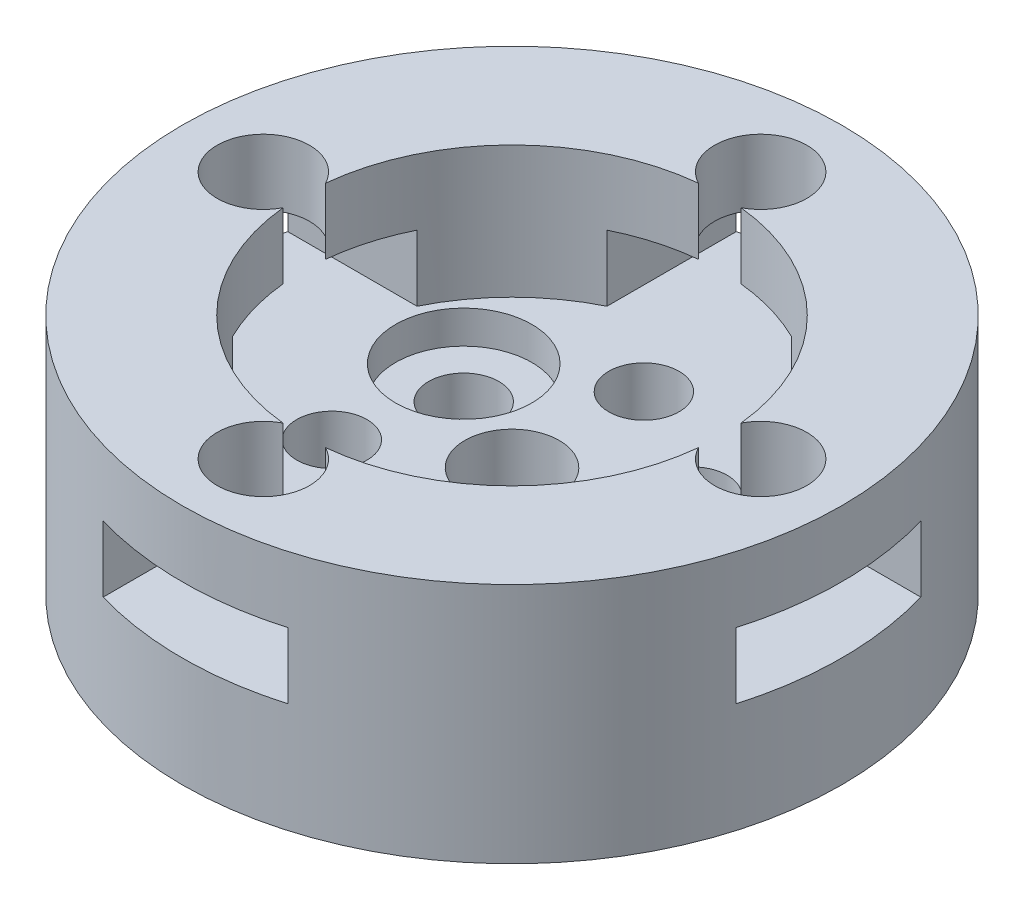
ISO-10303-21;
HEADER;
FILE_DESCRIPTION(('STEP AP214'),'2;1');
FILE_NAME('part.step','',(''),(''),'','','');
FILE_SCHEMA(('AUTOMOTIVE_DESIGN { 1 0 10303 214 1 1 1 1 }'));
ENDSEC;
DATA;
#1=APPLICATION_CONTEXT('core data for automotive mechanical design processes');
#2=APPLICATION_PROTOCOL_DEFINITION('international standard','automotive_design',2000,#1);
#3=PRODUCT_CONTEXT('',#1,'mechanical');
#4=PRODUCT('Part','Part','',(#3));
#5=PRODUCT_RELATED_PRODUCT_CATEGORY('part','',(#4));
#6=PRODUCT_DEFINITION_FORMATION('','',#4);
#7=PRODUCT_DEFINITION_CONTEXT('part definition',#1,'design');
#8=PRODUCT_DEFINITION('design','',#6,#7);
#9=PRODUCT_DEFINITION_SHAPE('','',#8);
#10=(LENGTH_UNIT() NAMED_UNIT(*) SI_UNIT(.MILLI.,.METRE.));
#11=(NAMED_UNIT(*) PLANE_ANGLE_UNIT() SI_UNIT($,.RADIAN.));
#12=(NAMED_UNIT(*) SI_UNIT($,.STERADIAN.) SOLID_ANGLE_UNIT());
#13=UNCERTAINTY_MEASURE_WITH_UNIT(LENGTH_MEASURE(1.E-05),#10,'distance_accuracy_value','');
#14=(GEOMETRIC_REPRESENTATION_CONTEXT(3) GLOBAL_UNCERTAINTY_ASSIGNED_CONTEXT((#13)) GLOBAL_UNIT_ASSIGNED_CONTEXT((#10,
#11,#12)) REPRESENTATION_CONTEXT('',''));
#15=CARTESIAN_POINT('',(0.,0.,0.));
#16=DIRECTION('',(0.,0.,1.));
#17=DIRECTION('',(1.,0.,0.));
#18=AXIS2_PLACEMENT_3D('',#15,#16,#17);
#19=CARTESIAN_POINT('',(0.,11.,0.));
#20=DIRECTION('',(0.,-1.,0.));
#21=DIRECTION('',(0.,0.,-1.));
#22=AXIS2_PLACEMENT_3D('',#19,#20,#21);
#23=CYLINDRICAL_SURFACE('',#22,15.);
#24=CARTESIAN_POINT('',(0.,5.,0.));
#25=DIRECTION('',(0.,-1.,0.));
#26=DIRECTION('',(0.,0.,-1.));
#27=AXIS2_PLACEMENT_3D('',#24,#25,#26);
#28=CIRCLE('',#27,15.);
#29=CARTESIAN_POINT('',(4.19999999999991,5.,-14.4));
#30=VERTEX_POINT('',#29);
#31=CARTESIAN_POINT('',(-4.20000000000009,5.,-14.4));
#32=VERTEX_POINT('',#31);
#33=EDGE_CURVE('E287',#30,#32,#28,.F.);
#34=ORIENTED_EDGE('',*,*,#33,.F.);
#35=DIRECTION('',(0.,-1.,0.));
#36=VECTOR('',#35,1.);
#37=CARTESIAN_POINT('',(4.19999999999991,11.,-14.4));
#38=LINE('',#37,#36);
#39=CARTESIAN_POINT('',(4.19999999999991,8.,-14.4));
#40=VERTEX_POINT('',#39);
#41=EDGE_CURVE('E293',#40,#30,#38,.T.);
#42=ORIENTED_EDGE('',*,*,#41,.F.);
#43=CARTESIAN_POINT('',(0.,8.,0.));
#44=DIRECTION('',(0.,-1.,0.));
#45=DIRECTION('',(0.,0.,-1.));
#46=AXIS2_PLACEMENT_3D('',#43,#44,#45);
#47=CIRCLE('',#46,15.);
#48=CARTESIAN_POINT('',(-4.20000000000009,8.,-14.4));
#49=VERTEX_POINT('',#48);
#50=EDGE_CURVE('E220',#40,#49,#47,.F.);
#51=ORIENTED_EDGE('',*,*,#50,.T.);
#52=DIRECTION('',(0.,-1.,0.));
#53=VECTOR('',#52,1.);
#54=CARTESIAN_POINT('',(-4.20000000000009,11.,-14.4));
#55=LINE('',#54,#53);
#56=EDGE_CURVE('E290',#32,#49,#55,.F.);
#57=ORIENTED_EDGE('',*,*,#56,.F.);
#58=EDGE_LOOP('',(#34,#42,#51,#57));
#59=FACE_BOUND('',#58,.T.);
#60=CARTESIAN_POINT('',(0.,5.,0.));
#61=DIRECTION('',(0.,-1.,0.));
#62=DIRECTION('',(0.,0.,-1.));
#63=AXIS2_PLACEMENT_3D('',#60,#61,#62);
#64=CIRCLE('',#63,15.);
#65=CARTESIAN_POINT('',(14.4000000000001,5.,4.19999999999958));
#66=VERTEX_POINT('',#65);
#67=CARTESIAN_POINT('',(14.3999999999999,5.,-4.20000000000042));
#68=VERTEX_POINT('',#67);
#69=EDGE_CURVE('E277',#66,#68,#64,.F.);
#70=ORIENTED_EDGE('',*,*,#69,.F.);
#71=DIRECTION('',(0.,-1.,0.));
#72=VECTOR('',#71,1.);
#73=CARTESIAN_POINT('',(14.4000000000001,11.,4.19999999999958));
#74=LINE('',#73,#72);
#75=CARTESIAN_POINT('',(14.4000000000001,8.,4.19999999999958));
#76=VERTEX_POINT('',#75);
#77=EDGE_CURVE('E284',#76,#66,#74,.T.);
#78=ORIENTED_EDGE('',*,*,#77,.F.);
#79=CARTESIAN_POINT('',(0.,8.,0.));
#80=DIRECTION('',(0.,-1.,0.));
#81=DIRECTION('',(0.,0.,-1.));
#82=AXIS2_PLACEMENT_3D('',#79,#80,#81);
#83=CIRCLE('',#82,15.);
#84=CARTESIAN_POINT('',(14.3999999999999,8.,-4.20000000000042));
#85=VERTEX_POINT('',#84);
#86=EDGE_CURVE('E247',#76,#85,#83,.F.);
#87=ORIENTED_EDGE('',*,*,#86,.T.);
#88=DIRECTION('',(0.,-1.,0.));
#89=VECTOR('',#88,1.);
#90=CARTESIAN_POINT('',(14.3999999999999,11.,-4.20000000000042));
#91=LINE('',#90,#89);
#92=EDGE_CURVE('E280',#68,#85,#91,.F.);
#93=ORIENTED_EDGE('',*,*,#92,.F.);
#94=EDGE_LOOP('',(#70,#78,#87,#93));
#95=FACE_BOUND('',#94,.T.);
#96=CARTESIAN_POINT('',(0.,5.,0.));
#97=DIRECTION('',(0.,-1.,0.));
#98=DIRECTION('',(0.,0.,-1.));
#99=AXIS2_PLACEMENT_3D('',#96,#97,#98);
#100=CIRCLE('',#99,15.);
#101=CARTESIAN_POINT('',(-4.19999999999967,5.,14.4000000000001));
#102=VERTEX_POINT('',#101);
#103=CARTESIAN_POINT('',(4.20000000000033,5.,14.3999999999999));
#104=VERTEX_POINT('',#103);
#105=EDGE_CURVE('E267',#102,#104,#100,.F.);
#106=ORIENTED_EDGE('',*,*,#105,.F.);
#107=DIRECTION('',(0.,-1.,0.));
#108=VECTOR('',#107,1.);
#109=CARTESIAN_POINT('',(-4.19999999999967,11.,14.4000000000001));
#110=LINE('',#109,#108);
#111=CARTESIAN_POINT('',(-4.19999999999967,8.,14.4000000000001));
#112=VERTEX_POINT('',#111);
#113=EDGE_CURVE('E274',#112,#102,#110,.T.);
#114=ORIENTED_EDGE('',*,*,#113,.F.);
#115=CARTESIAN_POINT('',(0.,8.,0.));
#116=DIRECTION('',(0.,-1.,0.));
#117=DIRECTION('',(0.,0.,-1.));
#118=AXIS2_PLACEMENT_3D('',#115,#116,#117);
#119=CIRCLE('',#118,15.);
#120=CARTESIAN_POINT('',(4.20000000000033,8.,14.3999999999999));
#121=VERTEX_POINT('',#120);
#122=EDGE_CURVE('E255',#112,#121,#119,.F.);
#123=ORIENTED_EDGE('',*,*,#122,.T.);
#124=DIRECTION('',(0.,-1.,0.));
#125=VECTOR('',#124,1.);
#126=CARTESIAN_POINT('',(4.20000000000033,11.,14.3999999999999));
#127=LINE('',#126,#125);
#128=EDGE_CURVE('E270',#104,#121,#127,.F.);
#129=ORIENTED_EDGE('',*,*,#128,.F.);
#130=EDGE_LOOP('',(#106,#114,#123,#129));
#131=FACE_BOUND('',#130,.T.);
#132=CARTESIAN_POINT('',(0.,11.,0.));
#133=DIRECTION('',(0.,-1.,0.));
#134=DIRECTION('',(0.,0.,-1.));
#135=AXIS2_PLACEMENT_3D('',#132,#133,#134);
#136=CIRCLE('',#135,15.);
#137=CARTESIAN_POINT('',(0.,11.,-15.));
#138=VERTEX_POINT('',#137);
#139=EDGE_CURVE('E337',#138,#138,#136,.T.);
#140=ORIENTED_EDGE('',*,*,#139,.T.);
#141=EDGE_LOOP('',(#140));
#142=FACE_BOUND('',#141,.T.);
#143=CARTESIAN_POINT('',(0.,0.,0.));
#144=DIRECTION('',(0.,-1.,0.));
#145=DIRECTION('',(0.,0.,-1.));
#146=AXIS2_PLACEMENT_3D('',#143,#144,#145);
#147=CIRCLE('',#146,15.);
#148=CARTESIAN_POINT('',(0.,0.,-15.));
#149=VERTEX_POINT('',#148);
#150=EDGE_CURVE('E335',#149,#149,#147,.T.);
#151=ORIENTED_EDGE('',*,*,#150,.F.);
#152=EDGE_LOOP('',(#151));
#153=FACE_BOUND('',#152,.T.);
#154=DIRECTION('',(0.,-1.,0.));
#155=VECTOR('',#154,1.);
#156=CARTESIAN_POINT('',(-14.4,11.,4.2));
#157=LINE('',#156,#155);
#158=CARTESIAN_POINT('',(-14.4,5.,4.2));
#159=VERTEX_POINT('',#158);
#160=CARTESIAN_POINT('',(-14.4,8.,4.2));
#161=VERTEX_POINT('',#160);
#162=EDGE_CURVE('E300',#159,#161,#157,.F.);
#163=ORIENTED_EDGE('',*,*,#162,.F.);
#164=CARTESIAN_POINT('',(0.,5.,0.));
#165=DIRECTION('',(0.,1.,0.));
#166=DIRECTION('',(0.,0.,1.));
#167=AXIS2_PLACEMENT_3D('',#164,#165,#166);
#168=CIRCLE('',#167,15.);
#169=CARTESIAN_POINT('',(-14.4,5.,-4.2));
#170=VERTEX_POINT('',#169);
#171=EDGE_CURVE('E296',#159,#170,#168,.F.);
#172=ORIENTED_EDGE('',*,*,#171,.T.);
#173=DIRECTION('',(0.,-1.,0.));
#174=VECTOR('',#173,1.);
#175=CARTESIAN_POINT('',(-14.4,11.,-4.2));
#176=LINE('',#175,#174);
#177=CARTESIAN_POINT('',(-14.4,8.,-4.2));
#178=VERTEX_POINT('',#177);
#179=EDGE_CURVE('E303',#178,#170,#176,.T.);
#180=ORIENTED_EDGE('',*,*,#179,.F.);
#181=CARTESIAN_POINT('',(0.,8.,0.));
#182=DIRECTION('',(0.,1.,0.));
#183=DIRECTION('',(0.,0.,1.));
#184=AXIS2_PLACEMENT_3D('',#181,#182,#183);
#185=CIRCLE('',#184,15.);
#186=EDGE_CURVE('E264',#161,#178,#185,.F.);
#187=ORIENTED_EDGE('',*,*,#186,.F.);
#188=EDGE_LOOP('',(#163,#172,#180,#187));
#189=FACE_BOUND('',#188,.T.);
#190=ADVANCED_FACE('F39',(#59,#95,#131,#142,#153,#189),#23,.T.);
#191=CARTESIAN_POINT('',(0.,11.,0.));
#192=DIRECTION('',(0.,-1.,0.));
#193=DIRECTION('',(0.,0.,-1.));
#194=AXIS2_PLACEMENT_3D('',#191,#192,#193);
#195=CYLINDRICAL_SURFACE('',#194,9.5);
#196=CARTESIAN_POINT('',(0.,5.,0.));
#197=DIRECTION('',(0.,1.,0.));
#198=DIRECTION('',(0.,0.,1.));
#199=AXIS2_PLACEMENT_3D('',#196,#197,#198);
#200=CIRCLE('',#199,9.5);
#201=CARTESIAN_POINT('',(-8.52115015710907,5.,4.2));
#202=VERTEX_POINT('',#201);
#203=CARTESIAN_POINT('',(-4.19999999999967,5.,8.52115015710923));
#204=VERTEX_POINT('',#203);
#205=EDGE_CURVE('E341',#202,#204,#200,.T.);
#206=ORIENTED_EDGE('',*,*,#205,.F.);
#207=DIRECTION('',(0.,-1.,0.));
#208=VECTOR('',#207,1.);
#209=CARTESIAN_POINT('',(-8.52115015710907,11.,4.2));
#210=LINE('',#209,#208);
#211=CARTESIAN_POINT('',(-8.52115015710907,8.,4.2));
#212=VERTEX_POINT('',#211);
#213=EDGE_CURVE('E11',#202,#212,#210,.F.);
#214=ORIENTED_EDGE('',*,*,#213,.T.);
#215=CARTESIAN_POINT('',(0.,8.,0.));
#216=DIRECTION('',(0.,1.,0.));
#217=DIRECTION('',(0.,0.,1.));
#218=AXIS2_PLACEMENT_3D('',#215,#216,#217);
#219=CIRCLE('',#218,9.5);
#220=CARTESIAN_POINT('',(-9.45048213055818,8.,0.968704031167638));
#221=VERTEX_POINT('',#220);
#222=EDGE_CURVE('E263',#212,#221,#219,.F.);
#223=ORIENTED_EDGE('',*,*,#222,.T.);
#224=DIRECTION('',(0.,1.,0.));
#225=VECTOR('',#224,1.);
#226=CARTESIAN_POINT('',(-9.45048213055818,9.5,0.968704031167638));
#227=LINE('',#226,#225);
#228=CARTESIAN_POINT('',(-9.45048213055818,11.,0.968704031167637));
#229=VERTEX_POINT('',#228);
#230=EDGE_CURVE('E413',#221,#229,#227,.T.);
#231=ORIENTED_EDGE('',*,*,#230,.T.);
#232=CARTESIAN_POINT('',(0.,11.,0.));
#233=DIRECTION('',(0.,-1.,0.));
#234=DIRECTION('',(0.,0.,-1.));
#235=AXIS2_PLACEMENT_3D('',#232,#233,#234);
#236=CIRCLE('',#235,9.5);
#237=CARTESIAN_POINT('',(-0.968704031167536,11.,9.45048213055819));
#238=VERTEX_POINT('',#237);
#239=EDGE_CURVE('E906',#238,#229,#236,.T.);
#240=ORIENTED_EDGE('',*,*,#239,.F.);
#241=DIRECTION('',(0.,1.,0.));
#242=VECTOR('',#241,1.);
#243=CARTESIAN_POINT('',(-0.96870403116754,9.5,9.4504821305582));
#244=LINE('',#243,#242);
#245=CARTESIAN_POINT('',(-0.968704031167536,8.,9.45048213055819));
#246=VERTEX_POINT('',#245);
#247=EDGE_CURVE('E434',#238,#246,#244,.F.);
#248=ORIENTED_EDGE('',*,*,#247,.T.);
#249=CARTESIAN_POINT('',(0.,8.,0.));
#250=DIRECTION('',(0.,-1.,0.));
#251=DIRECTION('',(0.,0.,-1.));
#252=AXIS2_PLACEMENT_3D('',#249,#250,#251);
#253=CIRCLE('',#252,9.5);
#254=CARTESIAN_POINT('',(-4.19999999999967,8.,8.52115015710923));
#255=VERTEX_POINT('',#254);
#256=EDGE_CURVE('E254',#255,#246,#253,.F.);
#257=ORIENTED_EDGE('',*,*,#256,.F.);
#258=DIRECTION('',(0.,-1.,0.));
#259=VECTOR('',#258,1.);
#260=CARTESIAN_POINT('',(-4.19999999999967,11.,8.52115015710923));
#261=LINE('',#260,#259);
#262=EDGE_CURVE('E456',#255,#204,#261,.T.);
#263=ORIENTED_EDGE('',*,*,#262,.T.);
#264=EDGE_LOOP('',(#206,#214,#223,#231,#240,#248,#257,#263));
#265=FACE_BOUND('',#264,.T.);
#266=ADVANCED_FACE('F496',(#265),#195,.F.);
#267=CARTESIAN_POINT('',(-9.45048213055819,8.,-0.96870403116762));
#268=VERTEX_POINT('',#267);
#269=CARTESIAN_POINT('',(-8.52115015710907,8.,-4.2));
#270=VERTEX_POINT('',#269);
#271=EDGE_CURVE('E259',#268,#270,#219,.F.);
#272=ORIENTED_EDGE('',*,*,#271,.T.);
#273=DIRECTION('',(0.,-1.,0.));
#274=VECTOR('',#273,1.);
#275=CARTESIAN_POINT('',(-8.52115015710907,11.,-4.2));
#276=LINE('',#275,#274);
#277=CARTESIAN_POINT('',(-8.52115015710907,5.,-4.2));
#278=VERTEX_POINT('',#277);
#279=EDGE_CURVE('E48',#270,#278,#276,.T.);
#280=ORIENTED_EDGE('',*,*,#279,.T.);
#281=CARTESIAN_POINT('',(-4.20000000000009,5.,-8.52115015710903));
#282=VERTEX_POINT('',#281);
#283=EDGE_CURVE('E475',#282,#278,#200,.T.);
#284=ORIENTED_EDGE('',*,*,#283,.F.);
#285=DIRECTION('',(0.,-1.,0.));
#286=VECTOR('',#285,1.);
#287=CARTESIAN_POINT('',(-4.20000000000009,11.,-8.52115015710903));
#288=LINE('',#287,#286);
#289=CARTESIAN_POINT('',(-4.20000000000009,8.,-8.52115015710903));
#290=VERTEX_POINT('',#289);
#291=EDGE_CURVE('E213',#282,#290,#288,.F.);
#292=ORIENTED_EDGE('',*,*,#291,.T.);
#293=CARTESIAN_POINT('',(0.,8.,0.));
#294=DIRECTION('',(0.,-1.,0.));
#295=DIRECTION('',(0.,0.,-1.));
#296=AXIS2_PLACEMENT_3D('',#293,#294,#295);
#297=CIRCLE('',#296,9.5);
#298=CARTESIAN_POINT('',(-0.968704031167415,8.,-9.45048213055821));
#299=VERTEX_POINT('',#298);
#300=EDGE_CURVE('E229',#299,#290,#297,.F.);
#301=ORIENTED_EDGE('',*,*,#300,.F.);
#302=DIRECTION('',(0.,1.,0.));
#303=VECTOR('',#302,1.);
#304=CARTESIAN_POINT('',(-0.968704031167414,9.5,-9.45048213055821));
#305=LINE('',#304,#303);
#306=CARTESIAN_POINT('',(-0.968704031167415,11.,-9.45048213055821));
#307=VERTEX_POINT('',#306);
#308=EDGE_CURVE('E446',#299,#307,#305,.T.);
#309=ORIENTED_EDGE('',*,*,#308,.T.);
#310=CARTESIAN_POINT('',(-9.45048213055819,11.,-0.96870403116762));
#311=VERTEX_POINT('',#310);
#312=EDGE_CURVE('E310',#311,#307,#236,.T.);
#313=ORIENTED_EDGE('',*,*,#312,.F.);
#314=DIRECTION('',(0.,1.,0.));
#315=VECTOR('',#314,1.);
#316=CARTESIAN_POINT('',(-9.45048213055819,9.5,-0.96870403116762));
#317=LINE('',#316,#315);
#318=EDGE_CURVE('E426',#311,#268,#317,.F.);
#319=ORIENTED_EDGE('',*,*,#318,.T.);
#320=EDGE_LOOP('',(#272,#280,#284,#292,#301,#309,#313,#319));
#321=FACE_BOUND('',#320,.T.);
#322=ADVANCED_FACE('F474',(#321),#195,.F.);
#323=CARTESIAN_POINT('',(0.,8.,0.));
#324=DIRECTION('',(0.,-1.,0.));
#325=DIRECTION('',(0.,0.,-1.));
#326=AXIS2_PLACEMENT_3D('',#323,#324,#325);
#327=CIRCLE('',#326,9.5);
#328=CARTESIAN_POINT('',(8.52115015710928,8.,4.19999999999958));
#329=VERTEX_POINT('',#328);
#330=CARTESIAN_POINT('',(9.4504821305582,8.,0.968704031167484));
#331=VERTEX_POINT('',#330);
#332=EDGE_CURVE('E246',#329,#331,#327,.F.);
#333=ORIENTED_EDGE('',*,*,#332,.F.);
#334=DIRECTION('',(0.,-1.,0.));
#335=VECTOR('',#334,1.);
#336=CARTESIAN_POINT('',(8.52115015710928,11.,4.19999999999958));
#337=LINE('',#336,#335);
#338=CARTESIAN_POINT('',(8.52115015710928,5.,4.19999999999958));
#339=VERTEX_POINT('',#338);
#340=EDGE_CURVE('E214',#329,#339,#337,.T.);
#341=ORIENTED_EDGE('',*,*,#340,.T.);
#342=CARTESIAN_POINT('',(4.20000000000033,5.,8.52115015710891));
#343=VERTEX_POINT('',#342);
#344=EDGE_CURVE('E345',#343,#339,#200,.T.);
#345=ORIENTED_EDGE('',*,*,#344,.F.);
#346=DIRECTION('',(0.,-1.,0.));
#347=VECTOR('',#346,1.);
#348=CARTESIAN_POINT('',(4.20000000000033,11.,8.52115015710891));
#349=LINE('',#348,#347);
#350=CARTESIAN_POINT('',(4.20000000000033,8.,8.52115015710891));
#351=VERTEX_POINT('',#350);
#352=EDGE_CURVE('E452',#343,#351,#349,.F.);
#353=ORIENTED_EDGE('',*,*,#352,.T.);
#354=CARTESIAN_POINT('',(0.968704031167545,8.,9.45048213055819));
#355=VERTEX_POINT('',#354);
#356=EDGE_CURVE('E251',#355,#351,#253,.F.);
#357=ORIENTED_EDGE('',*,*,#356,.F.);
#358=DIRECTION('',(0.,1.,0.));
#359=VECTOR('',#358,1.);
#360=CARTESIAN_POINT('',(0.968704031167549,9.5,9.4504821305582));
#361=LINE('',#360,#359);
#362=CARTESIAN_POINT('',(0.968704031167545,11.,9.45048213055819));
#363=VERTEX_POINT('',#362);
#364=EDGE_CURVE('E430',#355,#363,#361,.T.);
#365=ORIENTED_EDGE('',*,*,#364,.T.);
#366=CARTESIAN_POINT('',(9.4504821305582,11.,0.968704031167484));
#367=VERTEX_POINT('',#366);
#368=EDGE_CURVE('E336',#367,#363,#236,.T.);
#369=ORIENTED_EDGE('',*,*,#368,.F.);
#370=DIRECTION('',(0.,1.,0.));
#371=VECTOR('',#370,1.);
#372=CARTESIAN_POINT('',(9.45048213055821,9.5,0.968704031167491));
#373=LINE('',#372,#371);
#374=EDGE_CURVE('E442',#367,#331,#373,.F.);
#375=ORIENTED_EDGE('',*,*,#374,.T.);
#376=EDGE_LOOP('',(#333,#341,#345,#353,#357,#365,#369,#375));
#377=FACE_BOUND('',#376,.T.);
#378=ADVANCED_FACE('F619',(#377),#195,.F.);
#379=CARTESIAN_POINT('',(0.,5.,0.));
#380=DIRECTION('',(0.,1.,0.));
#381=DIRECTION('',(0.,0.,1.));
#382=AXIS2_PLACEMENT_3D('',#379,#380,#381);
#383=PLANE('',#382);
#384=ORIENTED_EDGE('',*,*,#283,.T.);
#385=DIRECTION('',(-1.,0.,0.));
#386=VECTOR('',#385,1.);
#387=CARTESIAN_POINT('',(-17.3137084989848,5.,-4.2));
#388=LINE('',#387,#386);
#389=EDGE_CURVE('E230',#278,#170,#388,.T.);
#390=ORIENTED_EDGE('',*,*,#389,.T.);
#391=ORIENTED_EDGE('',*,*,#171,.F.);
#392=DIRECTION('',(1.,0.,0.));
#393=VECTOR('',#392,1.);
#394=CARTESIAN_POINT('',(-17.3137084989848,5.,4.2));
#395=LINE('',#394,#393);
#396=EDGE_CURVE('E235',#159,#202,#395,.T.);
#397=ORIENTED_EDGE('',*,*,#396,.T.);
#398=ORIENTED_EDGE('',*,*,#205,.T.);
#399=DIRECTION('',(0.,0.,1.));
#400=VECTOR('',#399,1.);
#401=CARTESIAN_POINT('',(-4.19999999999967,5.,17.3137084989847));
#402=LINE('',#401,#400);
#403=EDGE_CURVE('E492',#204,#102,#402,.T.);
#404=ORIENTED_EDGE('',*,*,#403,.T.);
#405=ORIENTED_EDGE('',*,*,#105,.T.);
#406=DIRECTION('',(0.,0.,-1.));
#407=VECTOR('',#406,1.);
#408=CARTESIAN_POINT('',(4.20000000000033,5.,17.3137084989847));
#409=LINE('',#408,#407);
#410=EDGE_CURVE('E512',#104,#343,#409,.T.);
#411=ORIENTED_EDGE('',*,*,#410,.T.);
#412=ORIENTED_EDGE('',*,*,#344,.T.);
#413=DIRECTION('',(1.,0.,0.));
#414=VECTOR('',#413,1.);
#415=CARTESIAN_POINT('',(17.313708498985,5.,4.19999999999958));
#416=LINE('',#415,#414);
#417=EDGE_CURVE('E523',#339,#66,#416,.T.);
#418=ORIENTED_EDGE('',*,*,#417,.T.);
#419=ORIENTED_EDGE('',*,*,#69,.T.);
#420=DIRECTION('',(-1.,0.,0.));
#421=VECTOR('',#420,1.);
#422=CARTESIAN_POINT('',(17.313708498985,5.,-4.20000000000042));
#423=LINE('',#422,#421);
#424=CARTESIAN_POINT('',(8.52115015710887,5.,-4.20000000000042));
#425=VERTEX_POINT('',#424);
#426=EDGE_CURVE('E222',#68,#425,#423,.T.);
#427=ORIENTED_EDGE('',*,*,#426,.T.);
#428=CARTESIAN_POINT('',(4.19999999999991,5.,-8.52115015710912));
#429=VERTEX_POINT('',#428);
#430=EDGE_CURVE('E350',#425,#429,#200,.T.);
#431=ORIENTED_EDGE('',*,*,#430,.T.);
#432=DIRECTION('',(0.,0.,-1.));
#433=VECTOR('',#432,1.);
#434=CARTESIAN_POINT('',(4.19999999999991,5.,-17.3137084989851));
#435=LINE('',#434,#433);
#436=EDGE_CURVE('E207',#429,#30,#435,.T.);
#437=ORIENTED_EDGE('',*,*,#436,.T.);
#438=ORIENTED_EDGE('',*,*,#33,.T.);
#439=DIRECTION('',(0.,0.,1.));
#440=VECTOR('',#439,1.);
#441=CARTESIAN_POINT('',(-4.20000000000009,5.,-17.3137084989851));
#442=LINE('',#441,#440);
#443=EDGE_CURVE('E484',#32,#282,#442,.T.);
#444=ORIENTED_EDGE('',*,*,#443,.T.);
#445=EDGE_LOOP('',(#384,#390,#391,#397,#398,#404,#405,#411,#412,#418,#419,#427,#431,#437,#438,#444));
#446=FACE_BOUND('',#445,.T.);
#447=CARTESIAN_POINT('',(-5.19615242270664,5.,-3.));
#448=DIRECTION('',(0.,1.,0.));
#449=DIRECTION('',(0.,0.,1.));
#450=AXIS2_PLACEMENT_3D('',#447,#448,#449);
#451=CIRCLE('',#450,3.1);
#452=CARTESIAN_POINT('',(-5.19615242270664,5.,0.100000000000003));
#453=VERTEX_POINT('',#452);
#454=EDGE_CURVE('E356',#453,#453,#451,.T.);
#455=ORIENTED_EDGE('',*,*,#454,.F.);
#456=EDGE_LOOP('',(#455));
#457=FACE_BOUND('',#456,.T.);
#458=CARTESIAN_POINT('',(0.,5.,-6.));
#459=DIRECTION('',(0.,1.,0.));
#460=DIRECTION('',(0.,0.,1.));
#461=AXIS2_PLACEMENT_3D('',#458,#459,#460);
#462=CIRCLE('',#461,1.6);
#463=CARTESIAN_POINT('',(0.,5.,-4.4));
#464=VERTEX_POINT('',#463);
#465=EDGE_CURVE('E409',#464,#464,#462,.T.);
#466=ORIENTED_EDGE('',*,*,#465,.F.);
#467=EDGE_LOOP('',(#466));
#468=FACE_BOUND('',#467,.T.);
#469=CARTESIAN_POINT('',(5.19615242270637,5.,2.99999999999986));
#470=DIRECTION('',(0.,1.,0.));
#471=DIRECTION('',(0.,0.,1.));
#472=AXIS2_PLACEMENT_3D('',#469,#470,#471);
#473=CIRCLE('',#472,3.10000000000013);
#474=CARTESIAN_POINT('',(5.19615242270637,5.,6.09999999999998));
#475=VERTEX_POINT('',#474);
#476=EDGE_CURVE('E349',#475,#475,#473,.T.);
#477=ORIENTED_EDGE('',*,*,#476,.F.);
#478=EDGE_LOOP('',(#477));
#479=FACE_BOUND('',#478,.T.);
#480=CARTESIAN_POINT('',(0.,5.,6.));
#481=DIRECTION('',(0.,1.,0.));
#482=DIRECTION('',(0.,0.,1.));
#483=AXIS2_PLACEMENT_3D('',#480,#481,#482);
#484=CIRCLE('',#483,1.6);
#485=CARTESIAN_POINT('',(0.,5.,7.6));
#486=VERTEX_POINT('',#485);
#487=EDGE_CURVE('E381',#486,#486,#484,.T.);
#488=ORIENTED_EDGE('',*,*,#487,.F.);
#489=EDGE_LOOP('',(#488));
#490=FACE_BOUND('',#489,.T.);
#491=CARTESIAN_POINT('',(5.19615242270663,5.,-3.));
#492=DIRECTION('',(0.,1.,0.));
#493=DIRECTION('',(0.,0.,1.));
#494=AXIS2_PLACEMENT_3D('',#491,#492,#493);
#495=CIRCLE('',#494,1.6);
#496=CARTESIAN_POINT('',(5.19615242270663,5.,-1.4));
#497=VERTEX_POINT('',#496);
#498=EDGE_CURVE('E393',#497,#497,#495,.T.);
#499=ORIENTED_EDGE('',*,*,#498,.F.);
#500=EDGE_LOOP('',(#499));
#501=FACE_BOUND('',#500,.T.);
#502=CARTESIAN_POINT('',(0.,5.,0.));
#503=DIRECTION('',(0.,1.,0.));
#504=DIRECTION('',(0.,0.,1.));
#505=AXIS2_PLACEMENT_3D('',#502,#503,#504);
#506=CIRCLE('',#505,2.15);
#507=CARTESIAN_POINT('',(0.,5.,2.15));
#508=VERTEX_POINT('',#507);
#509=EDGE_CURVE('E401',#508,#508,#506,.T.);
#510=ORIENTED_EDGE('',*,*,#509,.F.);
#511=EDGE_LOOP('',(#510));
#512=FACE_BOUND('',#511,.T.);
#513=CARTESIAN_POINT('',(-5.19615242270663,5.,3.));
#514=DIRECTION('',(0.,1.,0.));
#515=DIRECTION('',(0.,0.,1.));
#516=AXIS2_PLACEMENT_3D('',#513,#514,#515);
#517=CIRCLE('',#516,1.6);
#518=CARTESIAN_POINT('',(-5.19615242270663,5.,4.6));
#519=VERTEX_POINT('',#518);
#520=EDGE_CURVE('E373',#519,#519,#517,.T.);
#521=ORIENTED_EDGE('',*,*,#520,.F.);
#522=EDGE_LOOP('',(#521));
#523=FACE_BOUND('',#522,.T.);
#524=ADVANCED_FACE('F481',(#446,#457,#468,#479,#490,#501,#512,#523),#383,.T.);
#525=CARTESIAN_POINT('',(5.19615242270663,5.,3.));
#526=DIRECTION('',(0.,-1.,0.));
#527=DIRECTION('',(0.,0.,-1.));
#528=AXIS2_PLACEMENT_3D('',#525,#526,#527);
#529=CYLINDRICAL_SURFACE('',#528,1.6);
#530=CARTESIAN_POINT('',(5.19615242270663,0.,3.));
#531=DIRECTION('',(0.,1.,0.));
#532=DIRECTION('',(0.,0.,1.));
#533=AXIS2_PLACEMENT_3D('',#530,#531,#532);
#534=CIRCLE('',#533,1.6);
#535=CARTESIAN_POINT('',(5.19615242270663,0.,4.6));
#536=VERTEX_POINT('',#535);
#537=EDGE_CURVE('E385',#536,#536,#534,.T.);
#538=ORIENTED_EDGE('',*,*,#537,.F.);
#539=EDGE_LOOP('',(#538));
#540=FACE_BOUND('',#539,.T.);
#541=CARTESIAN_POINT('',(5.19615242270663,3.5,3.));
#542=DIRECTION('',(0.,1.,0.));
#543=DIRECTION('',(0.,0.,1.));
#544=AXIS2_PLACEMENT_3D('',#541,#542,#543);
#545=CIRCLE('',#544,1.6);
#546=CARTESIAN_POINT('',(5.19615242270663,3.5,4.6));
#547=VERTEX_POINT('',#546);
#548=EDGE_CURVE('E372',#547,#547,#545,.T.);
#549=ORIENTED_EDGE('',*,*,#548,.T.);
#550=EDGE_LOOP('',(#549));
#551=FACE_BOUND('',#550,.T.);
#552=ADVANCED_FACE('F595',(#540,#551),#529,.F.);
#553=CARTESIAN_POINT('',(-5.19615242270664,5.,-3.));
#554=DIRECTION('',(0.,-1.,0.));
#555=DIRECTION('',(0.,0.,-1.));
#556=AXIS2_PLACEMENT_3D('',#553,#554,#555);
#557=CYLINDRICAL_SURFACE('',#556,1.6);
#558=CARTESIAN_POINT('',(-5.19615242270664,0.,-3.));
#559=DIRECTION('',(0.,1.,0.));
#560=DIRECTION('',(0.,0.,1.));
#561=AXIS2_PLACEMENT_3D('',#558,#559,#560);
#562=CIRCLE('',#561,1.6);
#563=CARTESIAN_POINT('',(-5.19615242270664,0.,-1.4));
#564=VERTEX_POINT('',#563);
#565=EDGE_CURVE('E367',#564,#564,#562,.T.);
#566=ORIENTED_EDGE('',*,*,#565,.F.);
#567=EDGE_LOOP('',(#566));
#568=FACE_BOUND('',#567,.T.);
#569=CARTESIAN_POINT('',(-5.19615242270664,3.5,-3.));
#570=DIRECTION('',(0.,1.,0.));
#571=DIRECTION('',(0.,0.,1.));
#572=AXIS2_PLACEMENT_3D('',#569,#570,#571);
#573=CIRCLE('',#572,1.6);
#574=CARTESIAN_POINT('',(-5.19615242270664,3.5,-1.4));
#575=VERTEX_POINT('',#574);
#576=EDGE_CURVE('E355',#575,#575,#573,.T.);
#577=ORIENTED_EDGE('',*,*,#576,.T.);
#578=EDGE_LOOP('',(#577));
#579=FACE_BOUND('',#578,.T.);
#580=ADVANCED_FACE('F592',(#568,#579),#557,.F.);
#581=CARTESIAN_POINT('',(0.,0.,0.));
#582=DIRECTION('',(0.,1.,0.));
#583=DIRECTION('',(0.,0.,1.));
#584=AXIS2_PLACEMENT_3D('',#581,#582,#583);
#585=PLANE('',#584);
#586=ORIENTED_EDGE('',*,*,#150,.T.);
#587=EDGE_LOOP('',(#586));
#588=FACE_BOUND('',#587,.T.);
#589=ORIENTED_EDGE('',*,*,#565,.T.);
#590=EDGE_LOOP('',(#589));
#591=FACE_BOUND('',#590,.T.);
#592=CARTESIAN_POINT('',(-5.19615242270663,0.,3.));
#593=DIRECTION('',(0.,1.,0.));
#594=DIRECTION('',(0.,0.,1.));
#595=AXIS2_PLACEMENT_3D('',#592,#593,#594);
#596=CIRCLE('',#595,1.6);
#597=CARTESIAN_POINT('',(-5.19615242270663,0.,4.6));
#598=VERTEX_POINT('',#597);
#599=EDGE_CURVE('E371',#598,#598,#596,.T.);
#600=ORIENTED_EDGE('',*,*,#599,.T.);
#601=EDGE_LOOP('',(#600));
#602=FACE_BOUND('',#601,.T.);
#603=CARTESIAN_POINT('',(0.,0.,6.));
#604=DIRECTION('',(0.,1.,0.));
#605=DIRECTION('',(0.,0.,1.));
#606=AXIS2_PLACEMENT_3D('',#603,#604,#605);
#607=CIRCLE('',#606,1.6);
#608=CARTESIAN_POINT('',(0.,0.,7.6));
#609=VERTEX_POINT('',#608);
#610=EDGE_CURVE('E377',#609,#609,#607,.T.);
#611=ORIENTED_EDGE('',*,*,#610,.T.);
#612=EDGE_LOOP('',(#611));
#613=FACE_BOUND('',#612,.T.);
#614=ORIENTED_EDGE('',*,*,#537,.T.);
#615=EDGE_LOOP('',(#614));
#616=FACE_BOUND('',#615,.T.);
#617=CARTESIAN_POINT('',(5.19615242270663,0.,-3.));
#618=DIRECTION('',(0.,1.,0.));
#619=DIRECTION('',(0.,0.,1.));
#620=AXIS2_PLACEMENT_3D('',#617,#618,#619);
#621=CIRCLE('',#620,1.6);
#622=CARTESIAN_POINT('',(5.19615242270663,0.,-1.4));
#623=VERTEX_POINT('',#622);
#624=EDGE_CURVE('E392',#623,#623,#621,.T.);
#625=ORIENTED_EDGE('',*,*,#624,.T.);
#626=EDGE_LOOP('',(#625));
#627=FACE_BOUND('',#626,.T.);
#628=CARTESIAN_POINT('',(0.,0.,0.));
#629=DIRECTION('',(0.,1.,0.));
#630=DIRECTION('',(0.,0.,1.));
#631=AXIS2_PLACEMENT_3D('',#628,#629,#630);
#632=CIRCLE('',#631,2.15);
#633=CARTESIAN_POINT('',(0.,0.,2.15));
#634=VERTEX_POINT('',#633);
#635=EDGE_CURVE('E397',#634,#634,#632,.T.);
#636=ORIENTED_EDGE('',*,*,#635,.T.);
#637=EDGE_LOOP('',(#636));
#638=FACE_BOUND('',#637,.T.);
#639=CARTESIAN_POINT('',(0.,0.,-6.));
#640=DIRECTION('',(0.,1.,0.));
#641=DIRECTION('',(0.,0.,1.));
#642=AXIS2_PLACEMENT_3D('',#639,#640,#641);
#643=CIRCLE('',#642,1.6);
#644=CARTESIAN_POINT('',(0.,0.,-4.4));
#645=VERTEX_POINT('',#644);
#646=EDGE_CURVE('E405',#645,#645,#643,.T.);
#647=ORIENTED_EDGE('',*,*,#646,.T.);
#648=EDGE_LOOP('',(#647));
#649=FACE_BOUND('',#648,.T.);
#650=ADVANCED_FACE('F41',(#588,#591,#602,#613,#616,#627,#638,#649),#585,.F.);
#651=CARTESIAN_POINT('',(0.,5.,-6.));
#652=DIRECTION('',(0.,-1.,0.));
#653=DIRECTION('',(0.,0.,-1.));
#654=AXIS2_PLACEMENT_3D('',#651,#652,#653);
#655=CYLINDRICAL_SURFACE('',#654,1.6);
#656=ORIENTED_EDGE('',*,*,#465,.T.);
#657=EDGE_LOOP('',(#656));
#658=FACE_BOUND('',#657,.T.);
#659=ORIENTED_EDGE('',*,*,#646,.F.);
#660=EDGE_LOOP('',(#659));
#661=FACE_BOUND('',#660,.T.);
#662=ADVANCED_FACE('F614',(#658,#661),#655,.F.);
#663=CARTESIAN_POINT('',(0.,5.,0.));
#664=DIRECTION('',(0.,-1.,0.));
#665=DIRECTION('',(0.,0.,-1.));
#666=AXIS2_PLACEMENT_3D('',#663,#664,#665);
#667=CYLINDRICAL_SURFACE('',#666,2.15);
#668=ORIENTED_EDGE('',*,*,#509,.T.);
#669=EDGE_LOOP('',(#668));
#670=FACE_BOUND('',#669,.T.);
#671=ORIENTED_EDGE('',*,*,#635,.F.);
#672=EDGE_LOOP('',(#671));
#673=FACE_BOUND('',#672,.T.);
#674=ADVANCED_FACE('F610',(#670,#673),#667,.F.);
#675=CARTESIAN_POINT('',(5.19615242270663,5.,-3.));
#676=DIRECTION('',(0.,-1.,0.));
#677=DIRECTION('',(0.,0.,-1.));
#678=AXIS2_PLACEMENT_3D('',#675,#676,#677);
#679=CYLINDRICAL_SURFACE('',#678,1.6);
#680=ORIENTED_EDGE('',*,*,#498,.T.);
#681=EDGE_LOOP('',(#680));
#682=FACE_BOUND('',#681,.T.);
#683=ORIENTED_EDGE('',*,*,#624,.F.);
#684=EDGE_LOOP('',(#683));
#685=FACE_BOUND('',#684,.T.);
#686=ADVANCED_FACE('F603',(#682,#685),#679,.F.);
#687=CARTESIAN_POINT('',(0.,5.,6.));
#688=DIRECTION('',(0.,-1.,0.));
#689=DIRECTION('',(0.,0.,-1.));
#690=AXIS2_PLACEMENT_3D('',#687,#688,#689);
#691=CYLINDRICAL_SURFACE('',#690,1.6);
#692=ORIENTED_EDGE('',*,*,#487,.T.);
#693=EDGE_LOOP('',(#692));
#694=FACE_BOUND('',#693,.T.);
#695=ORIENTED_EDGE('',*,*,#610,.F.);
#696=EDGE_LOOP('',(#695));
#697=FACE_BOUND('',#696,.T.);
#698=ADVANCED_FACE('F599',(#694,#697),#691,.F.);
#699=CARTESIAN_POINT('',(-5.19615242270663,5.,3.));
#700=DIRECTION('',(0.,-1.,0.));
#701=DIRECTION('',(0.,0.,-1.));
#702=AXIS2_PLACEMENT_3D('',#699,#700,#701);
#703=CYLINDRICAL_SURFACE('',#702,1.6);
#704=ORIENTED_EDGE('',*,*,#520,.T.);
#705=EDGE_LOOP('',(#704));
#706=FACE_BOUND('',#705,.T.);
#707=ORIENTED_EDGE('',*,*,#599,.F.);
#708=EDGE_LOOP('',(#707));
#709=FACE_BOUND('',#708,.T.);
#710=ADVANCED_FACE('F584',(#706,#709),#703,.F.);
#711=CARTESIAN_POINT('',(-5.19615242270664,3.5,-3.));
#712=DIRECTION('',(0.,1.,0.));
#713=DIRECTION('',(0.,0.,1.));
#714=AXIS2_PLACEMENT_3D('',#711,#712,#713);
#715=CYLINDRICAL_SURFACE('',#714,3.1);
#716=CARTESIAN_POINT('',(-5.19615242270664,3.5,-3.));
#717=DIRECTION('',(0.,1.,0.));
#718=DIRECTION('',(0.,0.,1.));
#719=AXIS2_PLACEMENT_3D('',#716,#717,#718);
#720=CIRCLE('',#719,3.1);
#721=CARTESIAN_POINT('',(-5.19615242270664,3.5,0.100000000000003));
#722=VERTEX_POINT('',#721);
#723=EDGE_CURVE('E351',#722,#722,#720,.T.);
#724=ORIENTED_EDGE('',*,*,#723,.F.);
#725=EDGE_LOOP('',(#724));
#726=FACE_BOUND('',#725,.T.);
#727=ORIENTED_EDGE('',*,*,#454,.T.);
#728=EDGE_LOOP('',(#727));
#729=FACE_BOUND('',#728,.T.);
#730=ADVANCED_FACE('F580',(#726,#729),#715,.F.);
#731=CARTESIAN_POINT('',(-5.19615242270664,3.5,-3.));
#732=DIRECTION('',(0.,1.,0.));
#733=DIRECTION('',(0.,0.,1.));
#734=AXIS2_PLACEMENT_3D('',#731,#732,#733);
#735=PLANE('',#734);
#736=ORIENTED_EDGE('',*,*,#576,.F.);
#737=EDGE_LOOP('',(#736));
#738=FACE_BOUND('',#737,.T.);
#739=ORIENTED_EDGE('',*,*,#723,.T.);
#740=EDGE_LOOP('',(#739));
#741=FACE_BOUND('',#740,.T.);
#742=ADVANCED_FACE('F576',(#738,#741),#735,.T.);
#743=CARTESIAN_POINT('',(5.19615242270637,3.5,2.99999999999986));
#744=DIRECTION('',(0.,1.,0.));
#745=DIRECTION('',(0.,0.,1.));
#746=AXIS2_PLACEMENT_3D('',#743,#744,#745);
#747=CYLINDRICAL_SURFACE('',#746,3.10000000000013);
#748=CARTESIAN_POINT('',(5.19615242270637,3.5,2.99999999999986));
#749=DIRECTION('',(0.,1.,0.));
#750=DIRECTION('',(0.,0.,1.));
#751=AXIS2_PLACEMENT_3D('',#748,#749,#750);
#752=CIRCLE('',#751,3.10000000000013);
#753=CARTESIAN_POINT('',(5.19615242270637,3.5,6.09999999999998));
#754=VERTEX_POINT('',#753);
#755=EDGE_CURVE('E360',#754,#754,#752,.T.);
#756=ORIENTED_EDGE('',*,*,#755,.F.);
#757=EDGE_LOOP('',(#756));
#758=FACE_BOUND('',#757,.T.);
#759=ORIENTED_EDGE('',*,*,#476,.T.);
#760=EDGE_LOOP('',(#759));
#761=FACE_BOUND('',#760,.T.);
#762=ADVANCED_FACE('F579',(#758,#761),#747,.F.);
#763=CARTESIAN_POINT('',(5.19615242270637,3.5,2.99999999999986));
#764=DIRECTION('',(0.,1.,0.));
#765=DIRECTION('',(0.,0.,1.));
#766=AXIS2_PLACEMENT_3D('',#763,#764,#765);
#767=PLANE('',#766);
#768=ORIENTED_EDGE('',*,*,#548,.F.);
#769=EDGE_LOOP('',(#768));
#770=FACE_BOUND('',#769,.T.);
#771=ORIENTED_EDGE('',*,*,#755,.T.);
#772=EDGE_LOOP('',(#771));
#773=FACE_BOUND('',#772,.T.);
#774=ADVANCED_FACE('F586',(#770,#773),#767,.T.);
#775=CARTESIAN_POINT('',(0.,11.,0.));
#776=DIRECTION('',(0.,-1.,0.));
#777=DIRECTION('',(0.,0.,-1.));
#778=AXIS2_PLACEMENT_3D('',#775,#776,#777);
#779=PLANE('',#778);
#780=ORIENTED_EDGE('',*,*,#312,.T.);
#781=CARTESIAN_POINT('',(0.,11.,-11.3137084989848));
#782=DIRECTION('',(0.,1.,0.));
#783=DIRECTION('',(0.,0.,1.));
#784=AXIS2_PLACEMENT_3D('',#781,#782,#783);
#785=CIRCLE('',#784,2.1);
#786=CARTESIAN_POINT('',(0.968704031167412,11.,-9.45048213055821));
#787=VERTEX_POINT('',#786);
#788=EDGE_CURVE('E311',#787,#307,#785,.T.);
#789=ORIENTED_EDGE('',*,*,#788,.F.);
#790=CARTESIAN_POINT('',(9.4504821305582,11.,-0.968704031167486));
#791=VERTEX_POINT('',#790);
#792=EDGE_CURVE('E331',#787,#791,#236,.T.);
#793=ORIENTED_EDGE('',*,*,#792,.T.);
#794=CARTESIAN_POINT('',(11.3137084989848,11.,0.));
#795=DIRECTION('',(0.,1.,0.));
#796=DIRECTION('',(0.,0.,1.));
#797=AXIS2_PLACEMENT_3D('',#794,#795,#796);
#798=CIRCLE('',#797,2.10000000000004);
#799=EDGE_CURVE('E317',#367,#791,#798,.T.);
#800=ORIENTED_EDGE('',*,*,#799,.F.);
#801=ORIENTED_EDGE('',*,*,#368,.T.);
#802=CARTESIAN_POINT('',(0.,11.,11.3137084989848));
#803=DIRECTION('',(0.,1.,0.));
#804=DIRECTION('',(0.,0.,1.));
#805=AXIS2_PLACEMENT_3D('',#802,#803,#804);
#806=CIRCLE('',#805,2.10000000000008);
#807=EDGE_CURVE('E323',#238,#363,#806,.T.);
#808=ORIENTED_EDGE('',*,*,#807,.F.);
#809=ORIENTED_EDGE('',*,*,#239,.T.);
#810=CARTESIAN_POINT('',(-11.3137084989848,11.,0.));
#811=DIRECTION('',(0.,1.,0.));
#812=DIRECTION('',(0.,0.,1.));
#813=AXIS2_PLACEMENT_3D('',#810,#811,#812);
#814=CIRCLE('',#813,2.10000000000012);
#815=EDGE_CURVE('E306',#311,#229,#814,.T.);
#816=ORIENTED_EDGE('',*,*,#815,.F.);
#817=EDGE_LOOP('',(#780,#789,#793,#800,#801,#808,#809,#816));
#818=FACE_BOUND('',#817,.T.);
#819=ORIENTED_EDGE('',*,*,#139,.F.);
#820=EDGE_LOOP('',(#819));
#821=FACE_BOUND('',#820,.T.);
#822=ADVANCED_FACE('F575',(#818,#821),#779,.F.);
#823=CARTESIAN_POINT('',(4.19999999999991,8.,-8.52115015710912));
#824=VERTEX_POINT('',#823);
#825=CARTESIAN_POINT('',(0.968704031167412,8.,-9.45048213055821));
#826=VERTEX_POINT('',#825);
#827=EDGE_CURVE('E217',#824,#826,#297,.F.);
#828=ORIENTED_EDGE('',*,*,#827,.F.);
#829=DIRECTION('',(0.,-1.,0.));
#830=VECTOR('',#829,1.);
#831=CARTESIAN_POINT('',(4.19999999999991,11.,-8.52115015710912));
#832=LINE('',#831,#830);
#833=EDGE_CURVE('E201',#824,#429,#832,.T.);
#834=ORIENTED_EDGE('',*,*,#833,.T.);
#835=ORIENTED_EDGE('',*,*,#430,.F.);
#836=DIRECTION('',(0.,-1.,0.));
#837=VECTOR('',#836,1.);
#838=CARTESIAN_POINT('',(8.52115015710887,11.,-4.20000000000042));
#839=LINE('',#838,#837);
#840=CARTESIAN_POINT('',(8.52115015710887,8.,-4.20000000000042));
#841=VERTEX_POINT('',#840);
#842=EDGE_CURVE('E460',#425,#841,#839,.F.);
#843=ORIENTED_EDGE('',*,*,#842,.T.);
#844=CARTESIAN_POINT('',(9.4504821305582,8.,-0.968704031167486));
#845=VERTEX_POINT('',#844);
#846=EDGE_CURVE('E243',#845,#841,#327,.F.);
#847=ORIENTED_EDGE('',*,*,#846,.F.);
#848=DIRECTION('',(0.,1.,0.));
#849=VECTOR('',#848,1.);
#850=CARTESIAN_POINT('',(9.45048213055821,9.5,-0.968704031167494));
#851=LINE('',#850,#849);
#852=EDGE_CURVE('E438',#845,#791,#851,.T.);
#853=ORIENTED_EDGE('',*,*,#852,.T.);
#854=ORIENTED_EDGE('',*,*,#792,.F.);
#855=DIRECTION('',(0.,1.,0.));
#856=VECTOR('',#855,1.);
#857=CARTESIAN_POINT('',(0.968704031167411,9.5,-9.45048213055821));
#858=LINE('',#857,#856);
#859=EDGE_CURVE('E227',#787,#826,#858,.F.);
#860=ORIENTED_EDGE('',*,*,#859,.T.);
#861=EDGE_LOOP('',(#828,#834,#835,#843,#847,#853,#854,#860));
#862=FACE_BOUND('',#861,.T.);
#863=ADVANCED_FACE('F225',(#862),#195,.F.);
#864=CARTESIAN_POINT('',(-11.3137084989848,8.,0.));
#865=DIRECTION('',(0.,1.,0.));
#866=DIRECTION('',(0.,0.,1.));
#867=AXIS2_PLACEMENT_3D('',#864,#865,#866);
#868=CYLINDRICAL_SURFACE('',#867,2.10000000000012);
#869=ORIENTED_EDGE('',*,*,#815,.T.);
#870=ORIENTED_EDGE('',*,*,#230,.F.);
#871=CARTESIAN_POINT('',(-11.3137084989848,8.,0.));
#872=DIRECTION('',(0.,1.,0.));
#873=DIRECTION('',(0.,0.,1.));
#874=AXIS2_PLACEMENT_3D('',#871,#872,#873);
#875=CIRCLE('',#874,2.10000000000012);
#876=EDGE_CURVE('E326',#268,#221,#875,.T.);
#877=ORIENTED_EDGE('',*,*,#876,.F.);
#878=ORIENTED_EDGE('',*,*,#318,.F.);
#879=EDGE_LOOP('',(#869,#870,#877,#878));
#880=FACE_BOUND('',#879,.T.);
#881=ADVANCED_FACE('F631',(#880),#868,.F.);
#882=CARTESIAN_POINT('',(0.,8.,11.3137084989848));
#883=DIRECTION('',(0.,1.,0.));
#884=DIRECTION('',(0.,0.,1.));
#885=AXIS2_PLACEMENT_3D('',#882,#883,#884);
#886=CYLINDRICAL_SURFACE('',#885,2.10000000000008);
#887=ORIENTED_EDGE('',*,*,#807,.T.);
#888=ORIENTED_EDGE('',*,*,#364,.F.);
#889=CARTESIAN_POINT('',(0.,8.,11.3137084989848));
#890=DIRECTION('',(0.,1.,0.));
#891=DIRECTION('',(0.,0.,1.));
#892=AXIS2_PLACEMENT_3D('',#889,#890,#891);
#893=CIRCLE('',#892,2.10000000000008);
#894=EDGE_CURVE('E320',#246,#355,#893,.T.);
#895=ORIENTED_EDGE('',*,*,#894,.F.);
#896=ORIENTED_EDGE('',*,*,#247,.F.);
#897=EDGE_LOOP('',(#887,#888,#895,#896));
#898=FACE_BOUND('',#897,.T.);
#899=ADVANCED_FACE('F636',(#898),#886,.F.);
#900=CARTESIAN_POINT('',(11.3137084989848,8.,0.));
#901=DIRECTION('',(0.,1.,0.));
#902=DIRECTION('',(0.,0.,1.));
#903=AXIS2_PLACEMENT_3D('',#900,#901,#902);
#904=CYLINDRICAL_SURFACE('',#903,2.10000000000004);
#905=ORIENTED_EDGE('',*,*,#799,.T.);
#906=ORIENTED_EDGE('',*,*,#852,.F.);
#907=CARTESIAN_POINT('',(11.3137084989848,8.,0.));
#908=DIRECTION('',(0.,1.,0.));
#909=DIRECTION('',(0.,0.,1.));
#910=AXIS2_PLACEMENT_3D('',#907,#908,#909);
#911=CIRCLE('',#910,2.10000000000004);
#912=EDGE_CURVE('E314',#331,#845,#911,.T.);
#913=ORIENTED_EDGE('',*,*,#912,.F.);
#914=ORIENTED_EDGE('',*,*,#374,.F.);
#915=EDGE_LOOP('',(#905,#906,#913,#914));
#916=FACE_BOUND('',#915,.T.);
#917=ADVANCED_FACE('F766',(#916),#904,.F.);
#918=CARTESIAN_POINT('',(0.,8.,-11.3137084989848));
#919=DIRECTION('',(0.,1.,0.));
#920=DIRECTION('',(0.,0.,1.));
#921=AXIS2_PLACEMENT_3D('',#918,#919,#920);
#922=CYLINDRICAL_SURFACE('',#921,2.1);
#923=ORIENTED_EDGE('',*,*,#788,.T.);
#924=ORIENTED_EDGE('',*,*,#308,.F.);
#925=CARTESIAN_POINT('',(0.,8.,-11.3137084989848));
#926=DIRECTION('',(0.,1.,0.));
#927=DIRECTION('',(0.,0.,1.));
#928=AXIS2_PLACEMENT_3D('',#925,#926,#927);
#929=CIRCLE('',#928,2.1);
#930=EDGE_CURVE('E307',#826,#299,#929,.T.);
#931=ORIENTED_EDGE('',*,*,#930,.F.);
#932=ORIENTED_EDGE('',*,*,#859,.F.);
#933=EDGE_LOOP('',(#923,#924,#931,#932));
#934=FACE_BOUND('',#933,.T.);
#935=ADVANCED_FACE('F776',(#934),#922,.F.);
#936=CARTESIAN_POINT('',(4.19999999999991,5.,-17.3137084989851));
#937=DIRECTION('',(1.,0.,0.));
#938=DIRECTION('',(0.,0.,-1.));
#939=AXIS2_PLACEMENT_3D('',#936,#937,#938);
#940=PLANE('',#939);
#941=ORIENTED_EDGE('',*,*,#41,.T.);
#942=ORIENTED_EDGE('',*,*,#436,.F.);
#943=ORIENTED_EDGE('',*,*,#833,.F.);
#944=DIRECTION('',(0.,0.,-1.));
#945=VECTOR('',#944,1.);
#946=CARTESIAN_POINT('',(4.19999999999991,8.,-17.3137084989851));
#947=LINE('',#946,#945);
#948=EDGE_CURVE('E204',#824,#40,#947,.T.);
#949=ORIENTED_EDGE('',*,*,#948,.T.);
#950=EDGE_LOOP('',(#941,#942,#943,#949));
#951=FACE_BOUND('',#950,.T.);
#952=ADVANCED_FACE('F203',(#951),#940,.F.);
#953=CARTESIAN_POINT('',(-4.20000000000009,5.,-17.3137084989851));
#954=DIRECTION('',(-1.,0.,0.));
#955=DIRECTION('',(0.,0.,1.));
#956=AXIS2_PLACEMENT_3D('',#953,#954,#955);
#957=PLANE('',#956);
#958=ORIENTED_EDGE('',*,*,#56,.T.);
#959=DIRECTION('',(0.,0.,1.));
#960=VECTOR('',#959,1.);
#961=CARTESIAN_POINT('',(-4.20000000000009,8.,-17.3137084989851));
#962=LINE('',#961,#960);
#963=EDGE_CURVE('E63',#49,#290,#962,.T.);
#964=ORIENTED_EDGE('',*,*,#963,.T.);
#965=ORIENTED_EDGE('',*,*,#291,.F.);
#966=ORIENTED_EDGE('',*,*,#443,.F.);
#967=EDGE_LOOP('',(#958,#964,#965,#966));
#968=FACE_BOUND('',#967,.T.);
#969=ADVANCED_FACE('F793',(#968),#957,.F.);
#970=CARTESIAN_POINT('',(0.,8.,0.));
#971=DIRECTION('',(0.,-1.,0.));
#972=DIRECTION('',(0.,0.,-1.));
#973=AXIS2_PLACEMENT_3D('',#970,#971,#972);
#974=PLANE('',#973);
#975=ORIENTED_EDGE('',*,*,#948,.F.);
#976=ORIENTED_EDGE('',*,*,#827,.T.);
#977=ORIENTED_EDGE('',*,*,#930,.T.);
#978=ORIENTED_EDGE('',*,*,#300,.T.);
#979=ORIENTED_EDGE('',*,*,#963,.F.);
#980=ORIENTED_EDGE('',*,*,#50,.F.);
#981=EDGE_LOOP('',(#975,#976,#977,#978,#979,#980));
#982=FACE_BOUND('',#981,.T.);
#983=ADVANCED_FACE('F216',(#982),#974,.T.);
#984=CARTESIAN_POINT('',(17.313708498985,5.,4.19999999999958));
#985=DIRECTION('',(0.,0.,1.));
#986=DIRECTION('',(1.,0.,0.));
#987=AXIS2_PLACEMENT_3D('',#984,#985,#986);
#988=PLANE('',#987);
#989=ORIENTED_EDGE('',*,*,#77,.T.);
#990=ORIENTED_EDGE('',*,*,#417,.F.);
#991=ORIENTED_EDGE('',*,*,#340,.F.);
#992=DIRECTION('',(1.,0.,0.));
#993=VECTOR('',#992,1.);
#994=CARTESIAN_POINT('',(17.313708498985,8.,4.19999999999958));
#995=LINE('',#994,#993);
#996=EDGE_CURVE('E516',#329,#76,#995,.T.);
#997=ORIENTED_EDGE('',*,*,#996,.T.);
#998=EDGE_LOOP('',(#989,#990,#991,#997));
#999=FACE_BOUND('',#998,.T.);
#1000=ADVANCED_FACE('F811',(#999),#988,.F.);
#1001=CARTESIAN_POINT('',(17.313708498985,5.,-4.20000000000042));
#1002=DIRECTION('',(0.,0.,-1.));
#1003=DIRECTION('',(-1.,0.,0.));
#1004=AXIS2_PLACEMENT_3D('',#1001,#1002,#1003);
#1005=PLANE('',#1004);
#1006=ORIENTED_EDGE('',*,*,#92,.T.);
#1007=DIRECTION('',(-1.,0.,0.));
#1008=VECTOR('',#1007,1.);
#1009=CARTESIAN_POINT('',(17.313708498985,8.,-4.20000000000042));
#1010=LINE('',#1009,#1008);
#1011=EDGE_CURVE('E519',#85,#841,#1010,.T.);
#1012=ORIENTED_EDGE('',*,*,#1011,.T.);
#1013=ORIENTED_EDGE('',*,*,#842,.F.);
#1014=ORIENTED_EDGE('',*,*,#426,.F.);
#1015=EDGE_LOOP('',(#1006,#1012,#1013,#1014));
#1016=FACE_BOUND('',#1015,.T.);
#1017=ADVANCED_FACE('F820',(#1016),#1005,.F.);
#1018=CARTESIAN_POINT('',(0.,8.,0.));
#1019=DIRECTION('',(0.,-1.,0.));
#1020=DIRECTION('',(0.,0.,-1.));
#1021=AXIS2_PLACEMENT_3D('',#1018,#1019,#1020);
#1022=PLANE('',#1021);
#1023=ORIENTED_EDGE('',*,*,#996,.F.);
#1024=ORIENTED_EDGE('',*,*,#332,.T.);
#1025=ORIENTED_EDGE('',*,*,#912,.T.);
#1026=ORIENTED_EDGE('',*,*,#846,.T.);
#1027=ORIENTED_EDGE('',*,*,#1011,.F.);
#1028=ORIENTED_EDGE('',*,*,#86,.F.);
#1029=EDGE_LOOP('',(#1023,#1024,#1025,#1026,#1027,#1028));
#1030=FACE_BOUND('',#1029,.T.);
#1031=ADVANCED_FACE('F830',(#1030),#1022,.T.);
#1032=CARTESIAN_POINT('',(-4.19999999999967,5.,17.3137084989847));
#1033=DIRECTION('',(-1.,0.,0.));
#1034=DIRECTION('',(0.,0.,1.));
#1035=AXIS2_PLACEMENT_3D('',#1032,#1033,#1034);
#1036=PLANE('',#1035);
#1037=ORIENTED_EDGE('',*,*,#113,.T.);
#1038=ORIENTED_EDGE('',*,*,#403,.F.);
#1039=ORIENTED_EDGE('',*,*,#262,.F.);
#1040=DIRECTION('',(0.,0.,1.));
#1041=VECTOR('',#1040,1.);
#1042=CARTESIAN_POINT('',(-4.19999999999967,8.,17.3137084989847));
#1043=LINE('',#1042,#1041);
#1044=EDGE_CURVE('E503',#255,#112,#1043,.T.);
#1045=ORIENTED_EDGE('',*,*,#1044,.T.);
#1046=EDGE_LOOP('',(#1037,#1038,#1039,#1045));
#1047=FACE_BOUND('',#1046,.T.);
#1048=ADVANCED_FACE('F502',(#1047),#1036,.F.);
#1049=CARTESIAN_POINT('',(4.20000000000033,5.,17.3137084989847));
#1050=DIRECTION('',(1.,0.,0.));
#1051=DIRECTION('',(0.,0.,-1.));
#1052=AXIS2_PLACEMENT_3D('',#1049,#1050,#1051);
#1053=PLANE('',#1052);
#1054=ORIENTED_EDGE('',*,*,#128,.T.);
#1055=DIRECTION('',(0.,0.,-1.));
#1056=VECTOR('',#1055,1.);
#1057=CARTESIAN_POINT('',(4.20000000000033,8.,17.3137084989847));
#1058=LINE('',#1057,#1056);
#1059=EDGE_CURVE('E239',#121,#351,#1058,.T.);
#1060=ORIENTED_EDGE('',*,*,#1059,.T.);
#1061=ORIENTED_EDGE('',*,*,#352,.F.);
#1062=ORIENTED_EDGE('',*,*,#410,.F.);
#1063=EDGE_LOOP('',(#1054,#1060,#1061,#1062));
#1064=FACE_BOUND('',#1063,.T.);
#1065=ADVANCED_FACE('F560',(#1064),#1053,.F.);
#1066=CARTESIAN_POINT('',(0.,8.,0.));
#1067=DIRECTION('',(0.,-1.,0.));
#1068=DIRECTION('',(0.,0.,-1.));
#1069=AXIS2_PLACEMENT_3D('',#1066,#1067,#1068);
#1070=PLANE('',#1069);
#1071=ORIENTED_EDGE('',*,*,#1044,.F.);
#1072=ORIENTED_EDGE('',*,*,#256,.T.);
#1073=ORIENTED_EDGE('',*,*,#894,.T.);
#1074=ORIENTED_EDGE('',*,*,#356,.T.);
#1075=ORIENTED_EDGE('',*,*,#1059,.F.);
#1076=ORIENTED_EDGE('',*,*,#122,.F.);
#1077=EDGE_LOOP('',(#1071,#1072,#1073,#1074,#1075,#1076));
#1078=FACE_BOUND('',#1077,.T.);
#1079=ADVANCED_FACE('F506',(#1078),#1070,.T.);
#1080=CARTESIAN_POINT('',(-17.3137084989848,5.,-4.2));
#1081=DIRECTION('',(0.,0.,-1.));
#1082=DIRECTION('',(-1.,0.,0.));
#1083=AXIS2_PLACEMENT_3D('',#1080,#1081,#1082);
#1084=PLANE('',#1083);
#1085=ORIENTED_EDGE('',*,*,#179,.T.);
#1086=ORIENTED_EDGE('',*,*,#389,.F.);
#1087=ORIENTED_EDGE('',*,*,#279,.F.);
#1088=DIRECTION('',(-1.,0.,0.));
#1089=VECTOR('',#1088,1.);
#1090=CARTESIAN_POINT('',(-17.3137084989848,8.,-4.2));
#1091=LINE('',#1090,#1089);
#1092=EDGE_CURVE('E539',#270,#178,#1091,.T.);
#1093=ORIENTED_EDGE('',*,*,#1092,.T.);
#1094=EDGE_LOOP('',(#1085,#1086,#1087,#1093));
#1095=FACE_BOUND('',#1094,.T.);
#1096=ADVANCED_FACE('F552',(#1095),#1084,.F.);
#1097=CARTESIAN_POINT('',(-17.3137084989848,5.,4.2));
#1098=DIRECTION('',(0.,0.,1.));
#1099=DIRECTION('',(1.,0.,0.));
#1100=AXIS2_PLACEMENT_3D('',#1097,#1098,#1099);
#1101=PLANE('',#1100);
#1102=ORIENTED_EDGE('',*,*,#162,.T.);
#1103=DIRECTION('',(1.,0.,0.));
#1104=VECTOR('',#1103,1.);
#1105=CARTESIAN_POINT('',(-17.3137084989848,8.,4.2));
#1106=LINE('',#1105,#1104);
#1107=EDGE_CURVE('E55',#161,#212,#1106,.T.);
#1108=ORIENTED_EDGE('',*,*,#1107,.T.);
#1109=ORIENTED_EDGE('',*,*,#213,.F.);
#1110=ORIENTED_EDGE('',*,*,#396,.F.);
#1111=EDGE_LOOP('',(#1102,#1108,#1109,#1110));
#1112=FACE_BOUND('',#1111,.T.);
#1113=ADVANCED_FACE('F546',(#1112),#1101,.F.);
#1114=CARTESIAN_POINT('',(0.,8.,0.));
#1115=DIRECTION('',(0.,1.,0.));
#1116=DIRECTION('',(0.,0.,1.));
#1117=AXIS2_PLACEMENT_3D('',#1114,#1115,#1116);
#1118=PLANE('',#1117);
#1119=ORIENTED_EDGE('',*,*,#186,.T.);
#1120=ORIENTED_EDGE('',*,*,#1092,.F.);
#1121=ORIENTED_EDGE('',*,*,#271,.F.);
#1122=ORIENTED_EDGE('',*,*,#876,.T.);
#1123=ORIENTED_EDGE('',*,*,#222,.F.);
#1124=ORIENTED_EDGE('',*,*,#1107,.F.);
#1125=EDGE_LOOP('',(#1119,#1120,#1121,#1122,#1123,#1124));
#1126=FACE_BOUND('',#1125,.T.);
#1127=ADVANCED_FACE('F551',(#1126),#1118,.F.);
#1128=CLOSED_SHELL('',(#190,#266,#322,#378,#524,#552,#580,#650,#662,#674,#686,#698,#710,#730,
#742,#762,#774,#822,#863,#881,#899,#917,#935,#952,#969,#983,#1000,#1017,#1031,#1048,#1065,#1079,
#1096,#1113,#1127));
#1129=MANIFOLD_SOLID_BREP('B2',#1128);
#1130=ADVANCED_BREP_SHAPE_REPRESENTATION('',(#18,#1129),#14);
#1131=SHAPE_DEFINITION_REPRESENTATION(#9,#1130);
ENDSEC;
END-ISO-10303-21;
